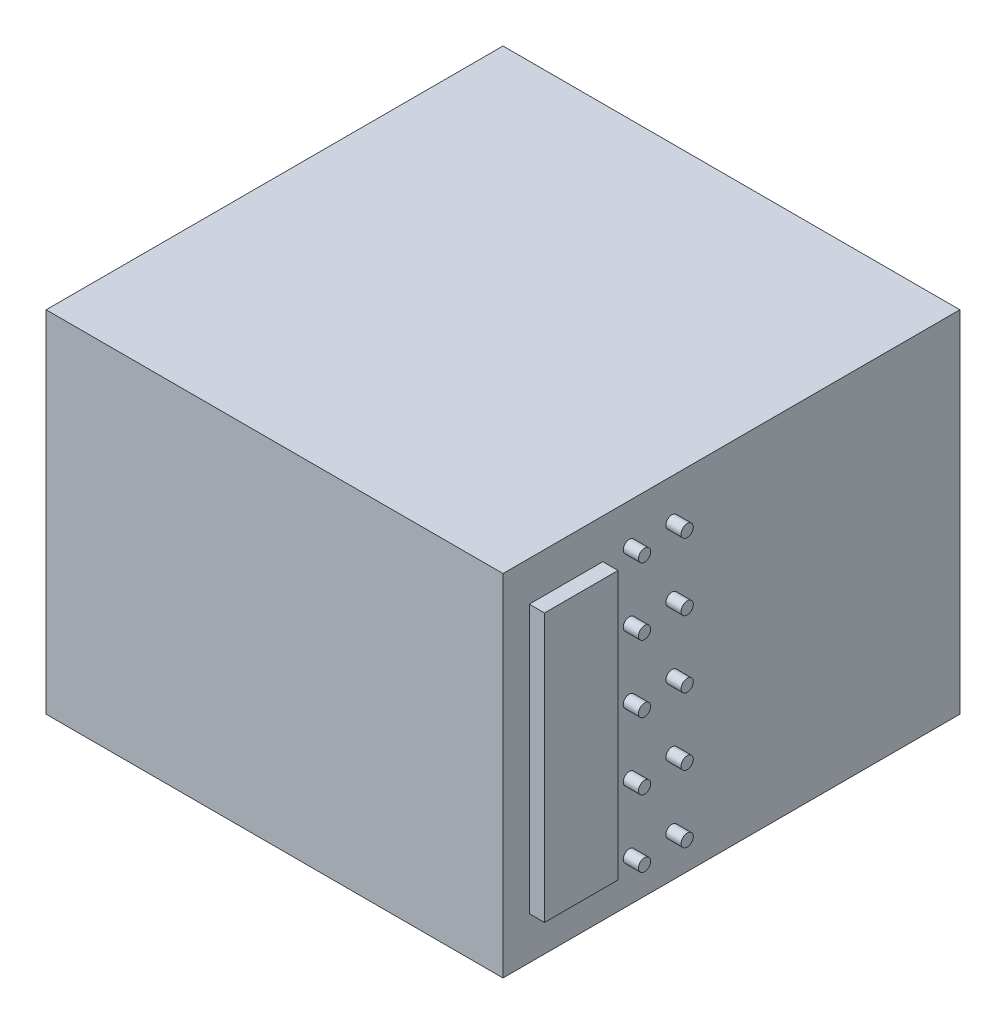
ISO-10303-21;
HEADER;
FILE_DESCRIPTION(('STEP AP214'),'2;1');
FILE_NAME('part.step','',(''),(''),'','','');
FILE_SCHEMA(('AUTOMOTIVE_DESIGN { 1 0 10303 214 1 1 1 1 }'));
ENDSEC;
DATA;
#1=APPLICATION_CONTEXT('core data for automotive mechanical design processes');
#2=APPLICATION_PROTOCOL_DEFINITION('international standard','automotive_design',2000,#1);
#3=PRODUCT_CONTEXT('',#1,'mechanical');
#4=PRODUCT('Part','Part','',(#3));
#5=PRODUCT_RELATED_PRODUCT_CATEGORY('part','',(#4));
#6=PRODUCT_DEFINITION_FORMATION('','',#4);
#7=PRODUCT_DEFINITION_CONTEXT('part definition',#1,'design');
#8=PRODUCT_DEFINITION('design','',#6,#7);
#9=PRODUCT_DEFINITION_SHAPE('','',#8);
#10=(LENGTH_UNIT() NAMED_UNIT(*) SI_UNIT(.MILLI.,.METRE.));
#11=(NAMED_UNIT(*) PLANE_ANGLE_UNIT() SI_UNIT($,.RADIAN.));
#12=(NAMED_UNIT(*) SI_UNIT($,.STERADIAN.) SOLID_ANGLE_UNIT());
#13=UNCERTAINTY_MEASURE_WITH_UNIT(LENGTH_MEASURE(1.E-05),#10,'distance_accuracy_value','');
#14=(GEOMETRIC_REPRESENTATION_CONTEXT(3) GLOBAL_UNCERTAINTY_ASSIGNED_CONTEXT((#13)) GLOBAL_UNIT_ASSIGNED_CONTEXT((#10,
#11,#12)) REPRESENTATION_CONTEXT('',''));
#15=CARTESIAN_POINT('',(0.,0.,0.));
#16=DIRECTION('',(0.,0.,1.));
#17=DIRECTION('',(1.,0.,0.));
#18=AXIS2_PLACEMENT_3D('',#15,#16,#17);
#19=CARTESIAN_POINT('',(7405.66037735849,9363.20754716982,1500.));
#20=DIRECTION('',(-1.,0.,0.));
#21=DIRECTION('',(0.,-1.,0.));
#22=AXIS2_PLACEMENT_3D('',#19,#20,#21);
#23=PLANE('',#22);
#24=CARTESIAN_POINT('',(7405.66037735849,9233.07440411493,1085.23447263174));
#25=DIRECTION('',(-1.,0.,0.));
#26=DIRECTION('',(0.,-1.,0.));
#27=AXIS2_PLACEMENT_3D('',#24,#25,#26);
#28=CIRCLE('',#27,19.9999999999997);
#29=CARTESIAN_POINT('',(7405.66037735849,9213.07440411493,1085.23447263174));
#30=VERTEX_POINT('',#29);
#31=EDGE_CURVE('E11',#30,#30,#28,.F.);
#32=ORIENTED_EDGE('',*,*,#31,.F.);
#33=EDGE_LOOP('',(#32));
#34=FACE_BOUND('',#33,.T.);
#35=CARTESIAN_POINT('',(7405.66037735849,9013.07440411493,1085.23447263174));
#36=DIRECTION('',(-1.,0.,0.));
#37=DIRECTION('',(0.,-1.,0.));
#38=AXIS2_PLACEMENT_3D('',#35,#36,#37);
#39=CIRCLE('',#38,19.9999999999997);
#40=CARTESIAN_POINT('',(7405.66037735849,8993.07440411493,1085.23447263174));
#41=VERTEX_POINT('',#40);
#42=EDGE_CURVE('E41',#41,#41,#39,.F.);
#43=ORIENTED_EDGE('',*,*,#42,.F.);
#44=EDGE_LOOP('',(#43));
#45=FACE_BOUND('',#44,.T.);
#46=CARTESIAN_POINT('',(7405.66037735849,8793.07440411493,1085.23447263174));
#47=DIRECTION('',(-1.,0.,0.));
#48=DIRECTION('',(0.,-1.,0.));
#49=AXIS2_PLACEMENT_3D('',#46,#47,#48);
#50=CIRCLE('',#49,19.9999999999997);
#51=CARTESIAN_POINT('',(7405.66037735849,8773.07440411493,1085.23447263174));
#52=VERTEX_POINT('',#51);
#53=EDGE_CURVE('E178',#52,#52,#50,.F.);
#54=ORIENTED_EDGE('',*,*,#53,.F.);
#55=EDGE_LOOP('',(#54));
#56=FACE_BOUND('',#55,.T.);
#57=CARTESIAN_POINT('',(7405.6603773585,8573.07440411493,1085.23447263174));
#58=DIRECTION('',(-1.,0.,0.));
#59=DIRECTION('',(0.,-1.,0.));
#60=AXIS2_PLACEMENT_3D('',#57,#58,#59);
#61=CIRCLE('',#60,19.9999999999997);
#62=CARTESIAN_POINT('',(7405.6603773585,8553.07440411493,1085.23447263174));
#63=VERTEX_POINT('',#62);
#64=EDGE_CURVE('E175',#63,#63,#61,.F.);
#65=ORIENTED_EDGE('',*,*,#64,.F.);
#66=EDGE_LOOP('',(#65));
#67=FACE_BOUND('',#66,.T.);
#68=CARTESIAN_POINT('',(7405.66037735849,9233.07440411493,945.234472631743));
#69=DIRECTION('',(-1.,0.,0.));
#70=DIRECTION('',(0.,-1.,0.));
#71=AXIS2_PLACEMENT_3D('',#68,#69,#70);
#72=CIRCLE('',#71,19.9999999999998);
#73=CARTESIAN_POINT('',(7405.66037735849,9213.07440411493,945.234472631743));
#74=VERTEX_POINT('',#73);
#75=EDGE_CURVE('E172',#74,#74,#72,.F.);
#76=ORIENTED_EDGE('',*,*,#75,.F.);
#77=EDGE_LOOP('',(#76));
#78=FACE_BOUND('',#77,.T.);
#79=CARTESIAN_POINT('',(7405.66037735849,9013.07440411493,945.234472631742));
#80=DIRECTION('',(-1.,0.,0.));
#81=DIRECTION('',(0.,-1.,0.));
#82=AXIS2_PLACEMENT_3D('',#79,#80,#81);
#83=CIRCLE('',#82,19.9999999999997);
#84=CARTESIAN_POINT('',(7405.66037735849,8993.07440411493,945.234472631742));
#85=VERTEX_POINT('',#84);
#86=EDGE_CURVE('E169',#85,#85,#83,.F.);
#87=ORIENTED_EDGE('',*,*,#86,.F.);
#88=EDGE_LOOP('',(#87));
#89=FACE_BOUND('',#88,.T.);
#90=CARTESIAN_POINT('',(7405.66037735849,8793.07440411493,945.234472631741));
#91=DIRECTION('',(-1.,0.,0.));
#92=DIRECTION('',(0.,-1.,0.));
#93=AXIS2_PLACEMENT_3D('',#90,#91,#92);
#94=CIRCLE('',#93,19.9999999999998);
#95=CARTESIAN_POINT('',(7405.66037735849,8773.07440411493,945.234472631741));
#96=VERTEX_POINT('',#95);
#97=EDGE_CURVE('E166',#96,#96,#94,.F.);
#98=ORIENTED_EDGE('',*,*,#97,.F.);
#99=EDGE_LOOP('',(#98));
#100=FACE_BOUND('',#99,.T.);
#101=CARTESIAN_POINT('',(7405.6603773585,8573.07440411493,945.234472631741));
#102=DIRECTION('',(-1.,0.,0.));
#103=DIRECTION('',(0.,-1.,0.));
#104=AXIS2_PLACEMENT_3D('',#101,#102,#103);
#105=CIRCLE('',#104,19.9999999999997);
#106=CARTESIAN_POINT('',(7405.6603773585,8553.07440411493,945.234472631741));
#107=VERTEX_POINT('',#106);
#108=EDGE_CURVE('E163',#107,#107,#105,.F.);
#109=ORIENTED_EDGE('',*,*,#108,.F.);
#110=EDGE_LOOP('',(#109));
#111=FACE_BOUND('',#110,.T.);
#112=CARTESIAN_POINT('',(7405.6603773585,8353.07440411493,945.23447263174));
#113=DIRECTION('',(-1.,0.,0.));
#114=DIRECTION('',(0.,-1.,0.));
#115=AXIS2_PLACEMENT_3D('',#112,#113,#114);
#116=CIRCLE('',#115,19.9999999999998);
#117=CARTESIAN_POINT('',(7405.6603773585,8333.07440411493,945.23447263174));
#118=VERTEX_POINT('',#117);
#119=EDGE_CURVE('E160',#118,#118,#116,.F.);
#120=ORIENTED_EDGE('',*,*,#119,.F.);
#121=EDGE_LOOP('',(#120));
#122=FACE_BOUND('',#121,.T.);
#123=DIRECTION('',(0.,1.,0.));
#124=VECTOR('',#123,1.);
#125=CARTESIAN_POINT('',(7405.66037735849,9363.20754716982,0.));
#126=LINE('',#125,#124);
#127=CARTESIAN_POINT('',(7405.6603773585,8213.20754716982,0.));
#128=VERTEX_POINT('',#127);
#129=CARTESIAN_POINT('',(7405.66037735849,9363.20754716982,0.));
#130=VERTEX_POINT('',#129);
#131=EDGE_CURVE('E143',#128,#130,#126,.T.);
#132=ORIENTED_EDGE('',*,*,#131,.T.);
#133=DIRECTION('',(0.,0.,-1.));
#134=VECTOR('',#133,1.);
#135=CARTESIAN_POINT('',(7405.66037735849,9363.20754716982,1500.));
#136=LINE('',#135,#134);
#137=CARTESIAN_POINT('',(7405.66037735849,9363.20754716982,1500.));
#138=VERTEX_POINT('',#137);
#139=EDGE_CURVE('E148',#138,#130,#136,.T.);
#140=ORIENTED_EDGE('',*,*,#139,.F.);
#141=DIRECTION('',(0.,1.,0.));
#142=VECTOR('',#141,1.);
#143=CARTESIAN_POINT('',(7405.66037735849,9363.20754716982,1500.));
#144=LINE('',#143,#142);
#145=CARTESIAN_POINT('',(7405.6603773585,8213.20754716982,1500.));
#146=VERTEX_POINT('',#145);
#147=EDGE_CURVE('E134',#146,#138,#144,.T.);
#148=ORIENTED_EDGE('',*,*,#147,.F.);
#149=DIRECTION('',(0.,0.,-1.));
#150=VECTOR('',#149,1.);
#151=CARTESIAN_POINT('',(7405.6603773585,8213.20754716982,1500.));
#152=LINE('',#151,#150);
#153=EDGE_CURVE('E151',#146,#128,#152,.T.);
#154=ORIENTED_EDGE('',*,*,#153,.T.);
#155=EDGE_LOOP('',(#132,#140,#148,#154));
#156=FACE_BOUND('',#155,.T.);
#157=CARTESIAN_POINT('',(7405.6603773585,8353.07440411493,1085.23447263174));
#158=DIRECTION('',(-1.,0.,0.));
#159=DIRECTION('',(0.,-1.,0.));
#160=AXIS2_PLACEMENT_3D('',#157,#158,#159);
#161=CIRCLE('',#160,19.9999999999997);
#162=CARTESIAN_POINT('',(7405.6603773585,8333.07440411493,1085.23447263174));
#163=VERTEX_POINT('',#162);
#164=EDGE_CURVE('E157',#163,#163,#161,.F.);
#165=ORIENTED_EDGE('',*,*,#164,.F.);
#166=EDGE_LOOP('',(#165));
#167=FACE_BOUND('',#166,.T.);
#168=DIRECTION('',(0.,-1.,0.));
#169=VECTOR('',#168,1.);
#170=CARTESIAN_POINT('',(7405.6603773585,8353.07440411493,1413.7341069801));
#171=LINE('',#170,#169);
#172=CARTESIAN_POINT('',(7405.66037735849,9233.07440411493,1413.7341069801));
#173=VERTEX_POINT('',#172);
#174=CARTESIAN_POINT('',(7405.6603773585,8353.07440411493,1413.7341069801));
#175=VERTEX_POINT('',#174);
#176=EDGE_CURVE('E118',#173,#175,#171,.T.);
#177=ORIENTED_EDGE('',*,*,#176,.F.);
#178=DIRECTION('',(0.,0.,1.));
#179=VECTOR('',#178,1.);
#180=CARTESIAN_POINT('',(7405.66037735849,9233.07440411493,1413.7341069801));
#181=LINE('',#180,#179);
#182=CARTESIAN_POINT('',(7405.66037735849,9233.07440411493,1172.32340834306));
#183=VERTEX_POINT('',#182);
#184=EDGE_CURVE('E115',#183,#173,#181,.T.);
#185=ORIENTED_EDGE('',*,*,#184,.F.);
#186=DIRECTION('',(0.,1.,0.));
#187=VECTOR('',#186,1.);
#188=CARTESIAN_POINT('',(7405.6603773585,8353.07440411493,1172.32340834306));
#189=LINE('',#188,#187);
#190=CARTESIAN_POINT('',(7405.6603773585,8353.07440411493,1172.32340834306));
#191=VERTEX_POINT('',#190);
#192=EDGE_CURVE('E53',#191,#183,#189,.T.);
#193=ORIENTED_EDGE('',*,*,#192,.F.);
#194=DIRECTION('',(0.,0.,-1.));
#195=VECTOR('',#194,1.);
#196=CARTESIAN_POINT('',(7405.6603773585,8353.07440411493,1413.7341069801));
#197=LINE('',#196,#195);
#198=EDGE_CURVE('E48',#175,#191,#197,.T.);
#199=ORIENTED_EDGE('',*,*,#198,.F.);
#200=EDGE_LOOP('',(#177,#185,#193,#199));
#201=FACE_BOUND('',#200,.T.);
#202=ADVANCED_FACE('F33',(#34,#45,#56,#67,#78,#89,#100,#111,#122,#156,#167,#201),#23,.F.);
#203=CARTESIAN_POINT('',(5905.6603773585,9363.20754716982,1500.));
#204=DIRECTION('',(1.,0.,0.));
#205=DIRECTION('',(0.,1.,0.));
#206=AXIS2_PLACEMENT_3D('',#203,#204,#205);
#207=PLANE('',#206);
#208=DIRECTION('',(0.,-1.,0.));
#209=VECTOR('',#208,1.);
#210=CARTESIAN_POINT('',(5905.6603773585,9363.20754716982,0.));
#211=LINE('',#210,#209);
#212=CARTESIAN_POINT('',(5905.6603773585,9363.20754716982,0.));
#213=VERTEX_POINT('',#212);
#214=CARTESIAN_POINT('',(5905.66037735849,8213.20754716982,0.));
#215=VERTEX_POINT('',#214);
#216=EDGE_CURVE('E122',#213,#215,#211,.T.);
#217=ORIENTED_EDGE('',*,*,#216,.T.);
#218=DIRECTION('',(0.,0.,-1.));
#219=VECTOR('',#218,1.);
#220=CARTESIAN_POINT('',(5905.66037735849,8213.20754716982,1500.));
#221=LINE('',#220,#219);
#222=CARTESIAN_POINT('',(5905.66037735849,8213.20754716982,1500.));
#223=VERTEX_POINT('',#222);
#224=EDGE_CURVE('E154',#223,#215,#221,.T.);
#225=ORIENTED_EDGE('',*,*,#224,.F.);
#226=DIRECTION('',(0.,-1.,0.));
#227=VECTOR('',#226,1.);
#228=CARTESIAN_POINT('',(5905.6603773585,9363.20754716982,1500.));
#229=LINE('',#228,#227);
#230=CARTESIAN_POINT('',(5905.6603773585,9363.20754716982,1500.));
#231=VERTEX_POINT('',#230);
#232=EDGE_CURVE('E128',#231,#223,#229,.T.);
#233=ORIENTED_EDGE('',*,*,#232,.F.);
#234=DIRECTION('',(0.,0.,-1.));
#235=VECTOR('',#234,1.);
#236=CARTESIAN_POINT('',(5905.6603773585,9363.20754716982,1500.));
#237=LINE('',#236,#235);
#238=EDGE_CURVE('E138',#231,#213,#237,.T.);
#239=ORIENTED_EDGE('',*,*,#238,.T.);
#240=EDGE_LOOP('',(#217,#225,#233,#239));
#241=FACE_BOUND('',#240,.T.);
#242=ADVANCED_FACE('F35',(#241),#207,.F.);
#243=CARTESIAN_POINT('',(5905.66037735849,8213.20754716982,1500.));
#244=DIRECTION('',(0.,1.,0.));
#245=DIRECTION('',(0.,0.,1.));
#246=AXIS2_PLACEMENT_3D('',#243,#244,#245);
#247=PLANE('',#246);
#248=DIRECTION('',(1.,0.,0.));
#249=VECTOR('',#248,1.);
#250=CARTESIAN_POINT('',(5905.66037735849,8213.20754716982,0.));
#251=LINE('',#250,#249);
#252=EDGE_CURVE('E141',#215,#128,#251,.T.);
#253=ORIENTED_EDGE('',*,*,#252,.T.);
#254=ORIENTED_EDGE('',*,*,#153,.F.);
#255=DIRECTION('',(1.,0.,0.));
#256=VECTOR('',#255,1.);
#257=CARTESIAN_POINT('',(5905.66037735849,8213.20754716982,1500.));
#258=LINE('',#257,#256);
#259=EDGE_CURVE('E131',#223,#146,#258,.T.);
#260=ORIENTED_EDGE('',*,*,#259,.F.);
#261=ORIENTED_EDGE('',*,*,#224,.T.);
#262=EDGE_LOOP('',(#253,#254,#260,#261));
#263=FACE_BOUND('',#262,.T.);
#264=ADVANCED_FACE('F354',(#263),#247,.F.);
#265=CARTESIAN_POINT('',(5905.6603773585,9363.20754716982,1500.));
#266=DIRECTION('',(0.,-1.,0.));
#267=DIRECTION('',(0.,0.,-1.));
#268=AXIS2_PLACEMENT_3D('',#265,#266,#267);
#269=PLANE('',#268);
#270=DIRECTION('',(-1.,0.,0.));
#271=VECTOR('',#270,1.);
#272=CARTESIAN_POINT('',(5905.6603773585,9363.20754716982,0.));
#273=LINE('',#272,#271);
#274=EDGE_CURVE('E132',#130,#213,#273,.T.);
#275=ORIENTED_EDGE('',*,*,#274,.T.);
#276=ORIENTED_EDGE('',*,*,#238,.F.);
#277=DIRECTION('',(-1.,0.,0.));
#278=VECTOR('',#277,1.);
#279=CARTESIAN_POINT('',(5905.6603773585,9363.20754716982,1500.));
#280=LINE('',#279,#278);
#281=EDGE_CURVE('E136',#138,#231,#280,.T.);
#282=ORIENTED_EDGE('',*,*,#281,.F.);
#283=ORIENTED_EDGE('',*,*,#139,.T.);
#284=EDGE_LOOP('',(#275,#276,#282,#283));
#285=FACE_BOUND('',#284,.T.);
#286=ADVANCED_FACE('F348',(#285),#269,.F.);
#287=CARTESIAN_POINT('',(0.,0.,1500.));
#288=DIRECTION('',(0.,0.,1.));
#289=DIRECTION('',(1.,0.,0.));
#290=AXIS2_PLACEMENT_3D('',#287,#288,#289);
#291=PLANE('',#290);
#292=ORIENTED_EDGE('',*,*,#232,.T.);
#293=ORIENTED_EDGE('',*,*,#259,.T.);
#294=ORIENTED_EDGE('',*,*,#147,.T.);
#295=ORIENTED_EDGE('',*,*,#281,.T.);
#296=EDGE_LOOP('',(#292,#293,#294,#295));
#297=FACE_BOUND('',#296,.T.);
#298=ADVANCED_FACE('F345',(#297),#291,.T.);
#299=CARTESIAN_POINT('',(0.,0.,0.));
#300=DIRECTION('',(0.,0.,1.));
#301=DIRECTION('',(1.,0.,0.));
#302=AXIS2_PLACEMENT_3D('',#299,#300,#301);
#303=PLANE('',#302);
#304=ORIENTED_EDGE('',*,*,#216,.F.);
#305=ORIENTED_EDGE('',*,*,#274,.F.);
#306=ORIENTED_EDGE('',*,*,#131,.F.);
#307=ORIENTED_EDGE('',*,*,#252,.F.);
#308=EDGE_LOOP('',(#304,#305,#306,#307));
#309=FACE_BOUND('',#308,.T.);
#310=ADVANCED_FACE('F343',(#309),#303,.F.);
#311=CARTESIAN_POINT('',(7455.6603773585,8353.07440411493,1085.23447263174));
#312=DIRECTION('',(-1.,0.,0.));
#313=DIRECTION('',(0.,-1.,0.));
#314=AXIS2_PLACEMENT_3D('',#311,#312,#313);
#315=CYLINDRICAL_SURFACE('',#314,19.9999999999997);
#316=CARTESIAN_POINT('',(7455.6603773585,8353.07440411493,1085.23447263174));
#317=DIRECTION('',(1.,0.,0.));
#318=DIRECTION('',(0.,1.,0.));
#319=AXIS2_PLACEMENT_3D('',#316,#317,#318);
#320=CIRCLE('',#319,19.9999999999997);
#321=CARTESIAN_POINT('',(7455.6603773585,8373.07440411493,1085.23447263174));
#322=VERTEX_POINT('',#321);
#323=EDGE_CURVE('E119',#322,#322,#320,.T.);
#324=ORIENTED_EDGE('',*,*,#323,.F.);
#325=EDGE_LOOP('',(#324));
#326=FACE_BOUND('',#325,.T.);
#327=ORIENTED_EDGE('',*,*,#164,.T.);
#328=EDGE_LOOP('',(#327));
#329=FACE_BOUND('',#328,.T.);
#330=ADVANCED_FACE('F339',(#326,#329),#315,.T.);
#331=CARTESIAN_POINT('',(7455.6603773585,8353.07440411493,1085.23447263174));
#332=DIRECTION('',(1.,0.,0.));
#333=DIRECTION('',(0.,1.,0.));
#334=AXIS2_PLACEMENT_3D('',#331,#332,#333);
#335=PLANE('',#334);
#336=ORIENTED_EDGE('',*,*,#323,.T.);
#337=EDGE_LOOP('',(#336));
#338=FACE_BOUND('',#337,.T.);
#339=ADVANCED_FACE('F336',(#338),#335,.T.);
#340=CARTESIAN_POINT('',(7455.6603773585,8353.07440411493,1413.7341069801));
#341=DIRECTION('',(0.,0.,-1.));
#342=DIRECTION('',(-1.,0.,0.));
#343=AXIS2_PLACEMENT_3D('',#340,#341,#342);
#344=PLANE('',#343);
#345=ORIENTED_EDGE('',*,*,#176,.T.);
#346=DIRECTION('',(-1.,0.,0.));
#347=VECTOR('',#346,1.);
#348=CARTESIAN_POINT('',(7455.6603773585,8353.07440411493,1413.7341069801));
#349=LINE('',#348,#347);
#350=CARTESIAN_POINT('',(7455.6603773585,8353.07440411493,1413.7341069801));
#351=VERTEX_POINT('',#350);
#352=EDGE_CURVE('E99',#351,#175,#349,.T.);
#353=ORIENTED_EDGE('',*,*,#352,.F.);
#354=DIRECTION('',(0.,-1.,0.));
#355=VECTOR('',#354,1.);
#356=CARTESIAN_POINT('',(7455.6603773585,8353.07440411493,1413.7341069801));
#357=LINE('',#356,#355);
#358=CARTESIAN_POINT('',(7455.66037735849,9233.07440411493,1413.7341069801));
#359=VERTEX_POINT('',#358);
#360=EDGE_CURVE('E106',#359,#351,#357,.T.);
#361=ORIENTED_EDGE('',*,*,#360,.F.);
#362=DIRECTION('',(-1.,0.,0.));
#363=VECTOR('',#362,1.);
#364=CARTESIAN_POINT('',(7455.66037735849,9233.07440411493,1413.7341069801));
#365=LINE('',#364,#363);
#366=EDGE_CURVE('E213',#359,#173,#365,.T.);
#367=ORIENTED_EDGE('',*,*,#366,.T.);
#368=EDGE_LOOP('',(#345,#353,#361,#367));
#369=FACE_BOUND('',#368,.T.);
#370=ADVANCED_FACE('F117',(#369),#344,.F.);
#371=CARTESIAN_POINT('',(7455.6603773585,8353.07440411493,1413.7341069801));
#372=DIRECTION('',(0.,1.,0.));
#373=DIRECTION('',(-1.,0.,0.));
#374=AXIS2_PLACEMENT_3D('',#371,#372,#373);
#375=PLANE('',#374);
#376=ORIENTED_EDGE('',*,*,#198,.T.);
#377=DIRECTION('',(-1.,0.,0.));
#378=VECTOR('',#377,1.);
#379=CARTESIAN_POINT('',(7455.6603773585,8353.07440411493,1172.32340834306));
#380=LINE('',#379,#378);
#381=CARTESIAN_POINT('',(7455.6603773585,8353.07440411493,1172.32340834306));
#382=VERTEX_POINT('',#381);
#383=EDGE_CURVE('E102',#382,#191,#380,.T.);
#384=ORIENTED_EDGE('',*,*,#383,.F.);
#385=DIRECTION('',(0.,0.,-1.));
#386=VECTOR('',#385,1.);
#387=CARTESIAN_POINT('',(7455.6603773585,8353.07440411493,1413.7341069801));
#388=LINE('',#387,#386);
#389=EDGE_CURVE('E95',#351,#382,#388,.T.);
#390=ORIENTED_EDGE('',*,*,#389,.F.);
#391=ORIENTED_EDGE('',*,*,#352,.T.);
#392=EDGE_LOOP('',(#376,#384,#390,#391));
#393=FACE_BOUND('',#392,.T.);
#394=ADVANCED_FACE('F97',(#393),#375,.F.);
#395=CARTESIAN_POINT('',(7455.6603773585,8353.07440411493,1172.32340834306));
#396=DIRECTION('',(0.,0.,1.));
#397=DIRECTION('',(1.,0.,0.));
#398=AXIS2_PLACEMENT_3D('',#395,#396,#397);
#399=PLANE('',#398);
#400=ORIENTED_EDGE('',*,*,#192,.T.);
#401=DIRECTION('',(-1.,0.,0.));
#402=VECTOR('',#401,1.);
#403=CARTESIAN_POINT('',(7455.66037735849,9233.07440411493,1172.32340834306));
#404=LINE('',#403,#402);
#405=CARTESIAN_POINT('',(7455.66037735849,9233.07440411493,1172.32340834306));
#406=VERTEX_POINT('',#405);
#407=EDGE_CURVE('E124',#406,#183,#404,.T.);
#408=ORIENTED_EDGE('',*,*,#407,.F.);
#409=DIRECTION('',(0.,1.,0.));
#410=VECTOR('',#409,1.);
#411=CARTESIAN_POINT('',(7455.6603773585,8353.07440411493,1172.32340834306));
#412=LINE('',#411,#410);
#413=EDGE_CURVE('E105',#382,#406,#412,.T.);
#414=ORIENTED_EDGE('',*,*,#413,.F.);
#415=ORIENTED_EDGE('',*,*,#383,.T.);
#416=EDGE_LOOP('',(#400,#408,#414,#415));
#417=FACE_BOUND('',#416,.T.);
#418=ADVANCED_FACE('F328',(#417),#399,.F.);
#419=CARTESIAN_POINT('',(7455.66037735849,9233.07440411493,1413.7341069801));
#420=DIRECTION('',(0.,-1.,0.));
#421=DIRECTION('',(1.,0.,0.));
#422=AXIS2_PLACEMENT_3D('',#419,#420,#421);
#423=PLANE('',#422);
#424=ORIENTED_EDGE('',*,*,#184,.T.);
#425=ORIENTED_EDGE('',*,*,#366,.F.);
#426=DIRECTION('',(0.,0.,1.));
#427=VECTOR('',#426,1.);
#428=CARTESIAN_POINT('',(7455.66037735849,9233.07440411493,1413.7341069801));
#429=LINE('',#428,#427);
#430=EDGE_CURVE('E111',#406,#359,#429,.T.);
#431=ORIENTED_EDGE('',*,*,#430,.F.);
#432=ORIENTED_EDGE('',*,*,#407,.T.);
#433=EDGE_LOOP('',(#424,#425,#431,#432));
#434=FACE_BOUND('',#433,.T.);
#435=ADVANCED_FACE('F212',(#434),#423,.F.);
#436=CARTESIAN_POINT('',(7455.6603773585,7.51310251075556E-12,0.));
#437=DIRECTION('',(-1.,0.,0.));
#438=DIRECTION('',(0.,-1.,0.));
#439=AXIS2_PLACEMENT_3D('',#436,#437,#438);
#440=PLANE('',#439);
#441=ORIENTED_EDGE('',*,*,#360,.T.);
#442=ORIENTED_EDGE('',*,*,#389,.T.);
#443=ORIENTED_EDGE('',*,*,#413,.T.);
#444=ORIENTED_EDGE('',*,*,#430,.T.);
#445=EDGE_LOOP('',(#441,#442,#443,#444));
#446=FACE_BOUND('',#445,.T.);
#447=ADVANCED_FACE('F109',(#446),#440,.F.);
#448=CARTESIAN_POINT('',(7455.6603773585,8353.07440411493,945.23447263174));
#449=DIRECTION('',(-1.,0.,0.));
#450=DIRECTION('',(0.,-1.,0.));
#451=AXIS2_PLACEMENT_3D('',#448,#449,#450);
#452=CYLINDRICAL_SURFACE('',#451,19.9999999999998);
#453=CARTESIAN_POINT('',(7455.6603773585,8353.07440411493,945.23447263174));
#454=DIRECTION('',(1.,0.,0.));
#455=DIRECTION('',(0.,1.,0.));
#456=AXIS2_PLACEMENT_3D('',#453,#454,#455);
#457=CIRCLE('',#456,19.9999999999998);
#458=CARTESIAN_POINT('',(7455.6603773585,8373.07440411493,945.23447263174));
#459=VERTEX_POINT('',#458);
#460=EDGE_CURVE('E208',#459,#459,#457,.T.);
#461=ORIENTED_EDGE('',*,*,#460,.F.);
#462=EDGE_LOOP('',(#461));
#463=FACE_BOUND('',#462,.T.);
#464=ORIENTED_EDGE('',*,*,#119,.T.);
#465=EDGE_LOOP('',(#464));
#466=FACE_BOUND('',#465,.T.);
#467=ADVANCED_FACE('F319',(#463,#466),#452,.T.);
#468=CARTESIAN_POINT('',(7455.6603773585,8353.07440411493,945.23447263174));
#469=DIRECTION('',(1.,0.,0.));
#470=DIRECTION('',(0.,1.,0.));
#471=AXIS2_PLACEMENT_3D('',#468,#469,#470);
#472=PLANE('',#471);
#473=ORIENTED_EDGE('',*,*,#460,.T.);
#474=EDGE_LOOP('',(#473));
#475=FACE_BOUND('',#474,.T.);
#476=ADVANCED_FACE('F315',(#475),#472,.T.);
#477=CARTESIAN_POINT('',(7455.6603773585,8573.07440411493,945.234472631741));
#478=DIRECTION('',(-1.,0.,0.));
#479=DIRECTION('',(0.,-1.,0.));
#480=AXIS2_PLACEMENT_3D('',#477,#478,#479);
#481=CYLINDRICAL_SURFACE('',#480,19.9999999999997);
#482=CARTESIAN_POINT('',(7455.6603773585,8573.07440411493,945.234472631741));
#483=DIRECTION('',(1.,0.,0.));
#484=DIRECTION('',(0.,1.,0.));
#485=AXIS2_PLACEMENT_3D('',#482,#483,#484);
#486=CIRCLE('',#485,19.9999999999997);
#487=CARTESIAN_POINT('',(7455.6603773585,8593.07440411493,945.234472631741));
#488=VERTEX_POINT('',#487);
#489=EDGE_CURVE('E224',#488,#488,#486,.T.);
#490=ORIENTED_EDGE('',*,*,#489,.F.);
#491=EDGE_LOOP('',(#490));
#492=FACE_BOUND('',#491,.T.);
#493=ORIENTED_EDGE('',*,*,#108,.T.);
#494=EDGE_LOOP('',(#493));
#495=FACE_BOUND('',#494,.T.);
#496=ADVANCED_FACE('F311',(#492,#495),#481,.T.);
#497=CARTESIAN_POINT('',(7455.6603773585,8573.07440411493,945.234472631741));
#498=DIRECTION('',(1.,0.,0.));
#499=DIRECTION('',(0.,1.,0.));
#500=AXIS2_PLACEMENT_3D('',#497,#498,#499);
#501=PLANE('',#500);
#502=ORIENTED_EDGE('',*,*,#489,.T.);
#503=EDGE_LOOP('',(#502));
#504=FACE_BOUND('',#503,.T.);
#505=ADVANCED_FACE('F307',(#504),#501,.T.);
#506=CARTESIAN_POINT('',(7455.66037735849,8793.07440411493,945.234472631741));
#507=DIRECTION('',(-1.,0.,0.));
#508=DIRECTION('',(0.,-1.,0.));
#509=AXIS2_PLACEMENT_3D('',#506,#507,#508);
#510=CYLINDRICAL_SURFACE('',#509,19.9999999999998);
#511=CARTESIAN_POINT('',(7455.66037735849,8793.07440411493,945.234472631741));
#512=DIRECTION('',(1.,0.,0.));
#513=DIRECTION('',(0.,1.,0.));
#514=AXIS2_PLACEMENT_3D('',#511,#512,#513);
#515=CIRCLE('',#514,19.9999999999998);
#516=CARTESIAN_POINT('',(7455.66037735849,8813.07440411493,945.234472631741));
#517=VERTEX_POINT('',#516);
#518=EDGE_CURVE('E227',#517,#517,#515,.T.);
#519=ORIENTED_EDGE('',*,*,#518,.F.);
#520=EDGE_LOOP('',(#519));
#521=FACE_BOUND('',#520,.T.);
#522=ORIENTED_EDGE('',*,*,#97,.T.);
#523=EDGE_LOOP('',(#522));
#524=FACE_BOUND('',#523,.T.);
#525=ADVANCED_FACE('F303',(#521,#524),#510,.T.);
#526=CARTESIAN_POINT('',(7455.66037735849,8793.07440411493,945.234472631741));
#527=DIRECTION('',(1.,0.,0.));
#528=DIRECTION('',(0.,1.,0.));
#529=AXIS2_PLACEMENT_3D('',#526,#527,#528);
#530=PLANE('',#529);
#531=ORIENTED_EDGE('',*,*,#518,.T.);
#532=EDGE_LOOP('',(#531));
#533=FACE_BOUND('',#532,.T.);
#534=ADVANCED_FACE('F299',(#533),#530,.T.);
#535=CARTESIAN_POINT('',(7455.66037735849,9013.07440411493,945.234472631742));
#536=DIRECTION('',(-1.,0.,0.));
#537=DIRECTION('',(0.,-1.,0.));
#538=AXIS2_PLACEMENT_3D('',#535,#536,#537);
#539=CYLINDRICAL_SURFACE('',#538,19.9999999999997);
#540=CARTESIAN_POINT('',(7455.66037735849,9013.07440411493,945.234472631742));
#541=DIRECTION('',(1.,0.,0.));
#542=DIRECTION('',(0.,1.,0.));
#543=AXIS2_PLACEMENT_3D('',#540,#541,#542);
#544=CIRCLE('',#543,19.9999999999997);
#545=CARTESIAN_POINT('',(7455.66037735849,9033.07440411493,945.234472631742));
#546=VERTEX_POINT('',#545);
#547=EDGE_CURVE('E230',#546,#546,#544,.T.);
#548=ORIENTED_EDGE('',*,*,#547,.F.);
#549=EDGE_LOOP('',(#548));
#550=FACE_BOUND('',#549,.T.);
#551=ORIENTED_EDGE('',*,*,#86,.T.);
#552=EDGE_LOOP('',(#551));
#553=FACE_BOUND('',#552,.T.);
#554=ADVANCED_FACE('F295',(#550,#553),#539,.T.);
#555=CARTESIAN_POINT('',(7455.66037735849,9013.07440411493,945.234472631742));
#556=DIRECTION('',(1.,0.,0.));
#557=DIRECTION('',(0.,1.,0.));
#558=AXIS2_PLACEMENT_3D('',#555,#556,#557);
#559=PLANE('',#558);
#560=ORIENTED_EDGE('',*,*,#547,.T.);
#561=EDGE_LOOP('',(#560));
#562=FACE_BOUND('',#561,.T.);
#563=ADVANCED_FACE('F291',(#562),#559,.T.);
#564=CARTESIAN_POINT('',(7455.66037735849,9233.07440411493,945.234472631743));
#565=DIRECTION('',(-1.,0.,0.));
#566=DIRECTION('',(0.,-1.,0.));
#567=AXIS2_PLACEMENT_3D('',#564,#565,#566);
#568=CYLINDRICAL_SURFACE('',#567,19.9999999999998);
#569=CARTESIAN_POINT('',(7455.66037735849,9233.07440411493,945.234472631743));
#570=DIRECTION('',(1.,0.,0.));
#571=DIRECTION('',(0.,1.,0.));
#572=AXIS2_PLACEMENT_3D('',#569,#570,#571);
#573=CIRCLE('',#572,19.9999999999998);
#574=CARTESIAN_POINT('',(7455.66037735849,9253.07440411493,945.234472631743));
#575=VERTEX_POINT('',#574);
#576=EDGE_CURVE('E233',#575,#575,#573,.T.);
#577=ORIENTED_EDGE('',*,*,#576,.F.);
#578=EDGE_LOOP('',(#577));
#579=FACE_BOUND('',#578,.T.);
#580=ORIENTED_EDGE('',*,*,#75,.T.);
#581=EDGE_LOOP('',(#580));
#582=FACE_BOUND('',#581,.T.);
#583=ADVANCED_FACE('F287',(#579,#582),#568,.T.);
#584=CARTESIAN_POINT('',(7455.66037735849,9233.07440411493,945.234472631743));
#585=DIRECTION('',(1.,0.,0.));
#586=DIRECTION('',(0.,1.,0.));
#587=AXIS2_PLACEMENT_3D('',#584,#585,#586);
#588=PLANE('',#587);
#589=ORIENTED_EDGE('',*,*,#576,.T.);
#590=EDGE_LOOP('',(#589));
#591=FACE_BOUND('',#590,.T.);
#592=ADVANCED_FACE('F283',(#591),#588,.T.);
#593=CARTESIAN_POINT('',(7455.6603773585,8573.07440411493,1085.23447263174));
#594=DIRECTION('',(-1.,0.,0.));
#595=DIRECTION('',(0.,-1.,0.));
#596=AXIS2_PLACEMENT_3D('',#593,#594,#595);
#597=CYLINDRICAL_SURFACE('',#596,19.9999999999997);
#598=CARTESIAN_POINT('',(7455.6603773585,8573.07440411493,1085.23447263174));
#599=DIRECTION('',(1.,0.,0.));
#600=DIRECTION('',(0.,1.,0.));
#601=AXIS2_PLACEMENT_3D('',#598,#599,#600);
#602=CIRCLE('',#601,19.9999999999997);
#603=CARTESIAN_POINT('',(7455.6603773585,8593.07440411493,1085.23447263174));
#604=VERTEX_POINT('',#603);
#605=EDGE_CURVE('E236',#604,#604,#602,.T.);
#606=ORIENTED_EDGE('',*,*,#605,.F.);
#607=EDGE_LOOP('',(#606));
#608=FACE_BOUND('',#607,.T.);
#609=ORIENTED_EDGE('',*,*,#64,.T.);
#610=EDGE_LOOP('',(#609));
#611=FACE_BOUND('',#610,.T.);
#612=ADVANCED_FACE('F279',(#608,#611),#597,.T.);
#613=CARTESIAN_POINT('',(7455.6603773585,8573.07440411493,1085.23447263174));
#614=DIRECTION('',(1.,0.,0.));
#615=DIRECTION('',(0.,1.,0.));
#616=AXIS2_PLACEMENT_3D('',#613,#614,#615);
#617=PLANE('',#616);
#618=ORIENTED_EDGE('',*,*,#605,.T.);
#619=EDGE_LOOP('',(#618));
#620=FACE_BOUND('',#619,.T.);
#621=ADVANCED_FACE('F275',(#620),#617,.T.);
#622=CARTESIAN_POINT('',(7455.66037735849,8793.07440411493,1085.23447263174));
#623=DIRECTION('',(-1.,0.,0.));
#624=DIRECTION('',(0.,-1.,0.));
#625=AXIS2_PLACEMENT_3D('',#622,#623,#624);
#626=CYLINDRICAL_SURFACE('',#625,19.9999999999997);
#627=CARTESIAN_POINT('',(7455.66037735849,8793.07440411493,1085.23447263174));
#628=DIRECTION('',(1.,0.,0.));
#629=DIRECTION('',(0.,1.,0.));
#630=AXIS2_PLACEMENT_3D('',#627,#628,#629);
#631=CIRCLE('',#630,19.9999999999997);
#632=CARTESIAN_POINT('',(7455.66037735849,8813.07440411493,1085.23447263174));
#633=VERTEX_POINT('',#632);
#634=EDGE_CURVE('E239',#633,#633,#631,.T.);
#635=ORIENTED_EDGE('',*,*,#634,.F.);
#636=EDGE_LOOP('',(#635));
#637=FACE_BOUND('',#636,.T.);
#638=ORIENTED_EDGE('',*,*,#53,.T.);
#639=EDGE_LOOP('',(#638));
#640=FACE_BOUND('',#639,.T.);
#641=ADVANCED_FACE('F271',(#637,#640),#626,.T.);
#642=CARTESIAN_POINT('',(7455.66037735849,8793.07440411493,1085.23447263174));
#643=DIRECTION('',(1.,0.,0.));
#644=DIRECTION('',(0.,1.,0.));
#645=AXIS2_PLACEMENT_3D('',#642,#643,#644);
#646=PLANE('',#645);
#647=ORIENTED_EDGE('',*,*,#634,.T.);
#648=EDGE_LOOP('',(#647));
#649=FACE_BOUND('',#648,.T.);
#650=ADVANCED_FACE('F267',(#649),#646,.T.);
#651=CARTESIAN_POINT('',(7455.66037735849,9013.07440411493,1085.23447263174));
#652=DIRECTION('',(-1.,0.,0.));
#653=DIRECTION('',(0.,-1.,0.));
#654=AXIS2_PLACEMENT_3D('',#651,#652,#653);
#655=CYLINDRICAL_SURFACE('',#654,19.9999999999997);
#656=CARTESIAN_POINT('',(7455.66037735849,9013.07440411493,1085.23447263174));
#657=DIRECTION('',(1.,0.,0.));
#658=DIRECTION('',(0.,1.,0.));
#659=AXIS2_PLACEMENT_3D('',#656,#657,#658);
#660=CIRCLE('',#659,19.9999999999997);
#661=CARTESIAN_POINT('',(7455.66037735849,9033.07440411493,1085.23447263174));
#662=VERTEX_POINT('',#661);
#663=EDGE_CURVE('E242',#662,#662,#660,.T.);
#664=ORIENTED_EDGE('',*,*,#663,.F.);
#665=EDGE_LOOP('',(#664));
#666=FACE_BOUND('',#665,.T.);
#667=ORIENTED_EDGE('',*,*,#42,.T.);
#668=EDGE_LOOP('',(#667));
#669=FACE_BOUND('',#668,.T.);
#670=ADVANCED_FACE('F183',(#666,#669),#655,.T.);
#671=CARTESIAN_POINT('',(7455.66037735849,9013.07440411493,1085.23447263174));
#672=DIRECTION('',(1.,0.,0.));
#673=DIRECTION('',(0.,1.,0.));
#674=AXIS2_PLACEMENT_3D('',#671,#672,#673);
#675=PLANE('',#674);
#676=ORIENTED_EDGE('',*,*,#663,.T.);
#677=EDGE_LOOP('',(#676));
#678=FACE_BOUND('',#677,.T.);
#679=ADVANCED_FACE('F254',(#678),#675,.T.);
#680=CARTESIAN_POINT('',(7455.66037735849,9233.07440411493,1085.23447263174));
#681=DIRECTION('',(-1.,0.,0.));
#682=DIRECTION('',(0.,-1.,0.));
#683=AXIS2_PLACEMENT_3D('',#680,#681,#682);
#684=CYLINDRICAL_SURFACE('',#683,19.9999999999997);
#685=CARTESIAN_POINT('',(7455.66037735849,9233.07440411493,1085.23447263174));
#686=DIRECTION('',(1.,0.,0.));
#687=DIRECTION('',(0.,1.,0.));
#688=AXIS2_PLACEMENT_3D('',#685,#686,#687);
#689=CIRCLE('',#688,19.9999999999997);
#690=CARTESIAN_POINT('',(7455.66037735849,9253.07440411493,1085.23447263174));
#691=VERTEX_POINT('',#690);
#692=EDGE_CURVE('E245',#691,#691,#689,.T.);
#693=ORIENTED_EDGE('',*,*,#692,.F.);
#694=EDGE_LOOP('',(#693));
#695=FACE_BOUND('',#694,.T.);
#696=ORIENTED_EDGE('',*,*,#31,.T.);
#697=EDGE_LOOP('',(#696));
#698=FACE_BOUND('',#697,.T.);
#699=ADVANCED_FACE('F251',(#695,#698),#684,.T.);
#700=CARTESIAN_POINT('',(7455.66037735849,9233.07440411493,1085.23447263174));
#701=DIRECTION('',(1.,0.,0.));
#702=DIRECTION('',(0.,1.,0.));
#703=AXIS2_PLACEMENT_3D('',#700,#701,#702);
#704=PLANE('',#703);
#705=ORIENTED_EDGE('',*,*,#692,.T.);
#706=EDGE_LOOP('',(#705));
#707=FACE_BOUND('',#706,.T.);
#708=ADVANCED_FACE('F249',(#707),#704,.T.);
#709=CLOSED_SHELL('',(#202,#242,#264,#286,#298,#310,#330,#339,#370,#394,#418,#435,#447,#467,
#476,#496,#505,#525,#534,#554,#563,#583,#592,#612,#621,#641,#650,#670,#679,#699,#708));
#710=MANIFOLD_SOLID_BREP('B2',#709);
#711=ADVANCED_BREP_SHAPE_REPRESENTATION('',(#18,#710),#14);
#712=SHAPE_DEFINITION_REPRESENTATION(#9,#711);
ENDSEC;
END-ISO-10303-21;
